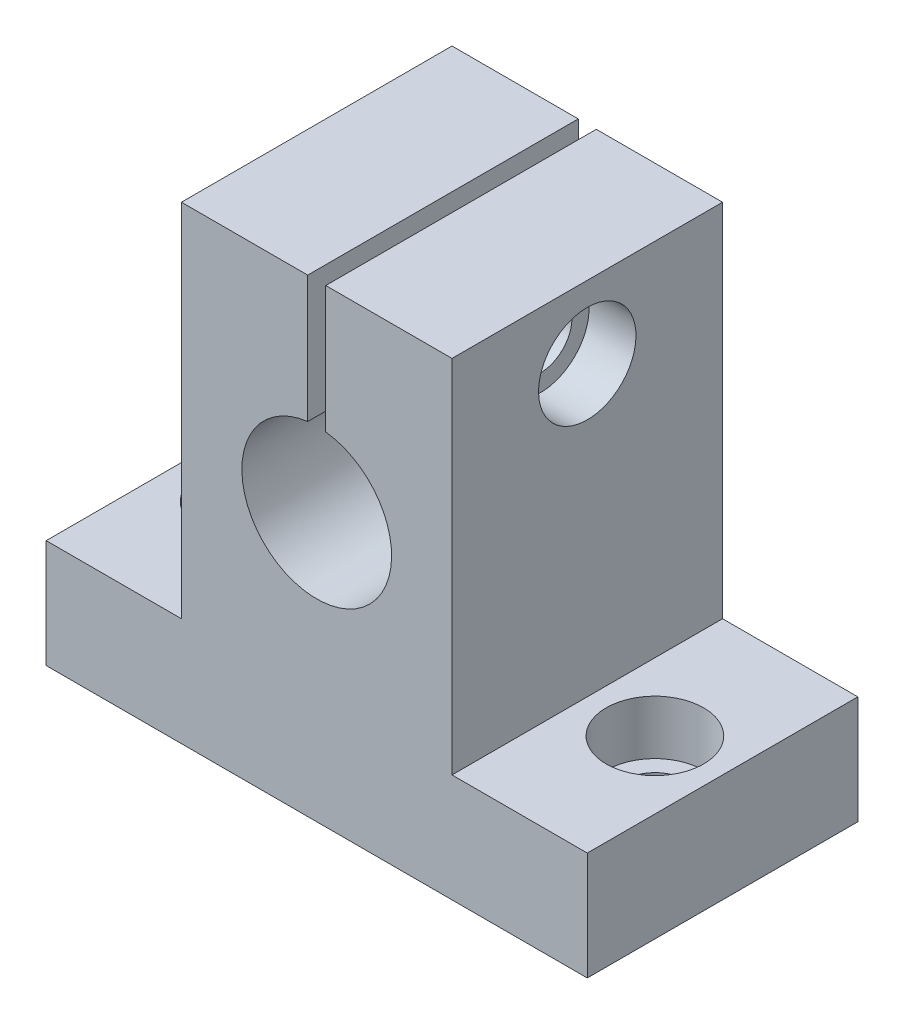
ISO-10303-21;
HEADER;
FILE_DESCRIPTION(('STEP AP214'),'2;1');
FILE_NAME('part.step','',(''),(''),'','','');
FILE_SCHEMA(('AUTOMOTIVE_DESIGN { 1 0 10303 214 1 1 1 1 }'));
ENDSEC;
DATA;
#1=APPLICATION_CONTEXT('core data for automotive mechanical design processes');
#2=APPLICATION_PROTOCOL_DEFINITION('international standard','automotive_design',2000,#1);
#3=PRODUCT_CONTEXT('',#1,'mechanical');
#4=PRODUCT('Part','Part','',(#3));
#5=PRODUCT_RELATED_PRODUCT_CATEGORY('part','',(#4));
#6=PRODUCT_DEFINITION_FORMATION('','',#4);
#7=PRODUCT_DEFINITION_CONTEXT('part definition',#1,'design');
#8=PRODUCT_DEFINITION('design','',#6,#7);
#9=PRODUCT_DEFINITION_SHAPE('','',#8);
#10=(LENGTH_UNIT() NAMED_UNIT(*) SI_UNIT(.MILLI.,.METRE.));
#11=(NAMED_UNIT(*) PLANE_ANGLE_UNIT() SI_UNIT($,.RADIAN.));
#12=(NAMED_UNIT(*) SI_UNIT($,.STERADIAN.) SOLID_ANGLE_UNIT());
#13=UNCERTAINTY_MEASURE_WITH_UNIT(LENGTH_MEASURE(1.E-05),#10,'distance_accuracy_value','');
#14=(GEOMETRIC_REPRESENTATION_CONTEXT(3) GLOBAL_UNCERTAINTY_ASSIGNED_CONTEXT((#13)) GLOBAL_UNIT_ASSIGNED_CONTEXT((#10,
#11,#12)) REPRESENTATION_CONTEXT('',''));
#15=CARTESIAN_POINT('',(0.,0.,0.));
#16=DIRECTION('',(0.,0.,1.));
#17=DIRECTION('',(1.,0.,0.));
#18=AXIS2_PLACEMENT_3D('',#15,#16,#17);
#19=CARTESIAN_POINT('',(11.25,-52.963943389495,7.5));
#20=DIRECTION('',(0.,1.,0.));
#21=DIRECTION('',(0.,0.,1.));
#22=AXIS2_PLACEMENT_3D('',#19,#20,#21);
#23=CYLINDRICAL_SURFACE('',#22,1.75);
#24=CARTESIAN_POINT('',(11.25,-16.,7.5));
#25=DIRECTION('',(0.,1.,0.));
#26=DIRECTION('',(0.,0.,1.));
#27=AXIS2_PLACEMENT_3D('',#24,#25,#26);
#28=CIRCLE('',#27,1.75);
#29=CARTESIAN_POINT('',(11.25,-16.,9.25));
#30=VERTEX_POINT('',#29);
#31=EDGE_CURVE('E280',#30,#30,#28,.F.);
#32=ORIENTED_EDGE('',*,*,#31,.T.);
#33=EDGE_LOOP('',(#32));
#34=FACE_BOUND('',#33,.T.);
#35=CARTESIAN_POINT('',(11.25,-13.,7.5));
#36=DIRECTION('',(0.,1.,0.));
#37=DIRECTION('',(-1.,0.,0.));
#38=AXIS2_PLACEMENT_3D('',#35,#36,#37);
#39=CIRCLE('',#38,1.75);
#40=CARTESIAN_POINT('',(9.5,-13.,7.5));
#41=VERTEX_POINT('',#40);
#42=EDGE_CURVE('E695',#41,#41,#39,.T.);
#43=ORIENTED_EDGE('',*,*,#42,.T.);
#44=EDGE_LOOP('',(#43));
#45=FACE_BOUND('',#44,.T.);
#46=ADVANCED_FACE('F16',(#34,#45),#23,.F.);
#47=CARTESIAN_POINT('',(-7.5,-1.09983721300845,15.));
#48=DIRECTION('',(1.,0.,0.));
#49=DIRECTION('',(0.,0.,-1.));
#50=AXIS2_PLACEMENT_3D('',#47,#48,#49);
#51=PLANE('',#50);
#52=DIRECTION('',(0.,-1.,0.));
#53=VECTOR('',#52,1.);
#54=CARTESIAN_POINT('',(-7.5,-1.09983721300845,0.));
#55=LINE('',#54,#53);
#56=CARTESIAN_POINT('',(-7.5,10.,0.));
#57=VERTEX_POINT('',#56);
#58=CARTESIAN_POINT('',(-7.5,-10.,0.));
#59=VERTEX_POINT('',#58);
#60=EDGE_CURVE('E343',#57,#59,#55,.T.);
#61=ORIENTED_EDGE('',*,*,#60,.T.);
#62=DIRECTION('',(0.,0.,-1.));
#63=VECTOR('',#62,1.);
#64=CARTESIAN_POINT('',(-7.5,-10.,15.));
#65=LINE('',#64,#63);
#66=CARTESIAN_POINT('',(-7.5,-10.,15.));
#67=VERTEX_POINT('',#66);
#68=EDGE_CURVE('E26',#67,#59,#65,.T.);
#69=ORIENTED_EDGE('',*,*,#68,.F.);
#70=DIRECTION('',(0.,-1.,0.));
#71=VECTOR('',#70,1.);
#72=CARTESIAN_POINT('',(-7.5,-1.09983721300845,15.));
#73=LINE('',#72,#71);
#74=CARTESIAN_POINT('',(-7.5,10.,15.));
#75=VERTEX_POINT('',#74);
#76=EDGE_CURVE('E308',#75,#67,#73,.T.);
#77=ORIENTED_EDGE('',*,*,#76,.F.);
#78=DIRECTION('',(0.,0.,-1.));
#79=VECTOR('',#78,1.);
#80=CARTESIAN_POINT('',(-7.5,10.,15.));
#81=LINE('',#80,#79);
#82=EDGE_CURVE('E10',#75,#57,#81,.T.);
#83=ORIENTED_EDGE('',*,*,#82,.T.);
#84=EDGE_LOOP('',(#61,#69,#77,#83));
#85=FACE_BOUND('',#84,.T.);
#86=DIRECTION('',(0.,-0.631260755806336,0.77557066614127));
#87=VECTOR('',#86,1.);
#88=CARTESIAN_POINT('',(-7.5,8.17159786519556,9.26753011625774));
#89=LINE('',#88,#87);
#90=CARTESIAN_POINT('',(-7.5,9.19208185361773,8.01375750421547));
#91=VERTEX_POINT('',#90);
#92=CARTESIAN_POINT('',(-7.5,7.15111387677338,10.5213027283));
#93=VERTEX_POINT('',#92);
#94=EDGE_CURVE('E193',#91,#93,#89,.T.);
#95=ORIENTED_EDGE('',*,*,#94,.T.);
#96=DIRECTION('',(0.,-0.987294277211527,-0.158902517869818));
#97=VECTOR('',#96,1.);
#98=CARTESIAN_POINT('',(-7.5,5.55507294996451,10.2644239761923));
#99=LINE('',#98,#97);
#100=CARTESIAN_POINT('',(-7.5,3.95903202315564,10.0075452240845));
#101=VERTEX_POINT('',#100);
#102=EDGE_CURVE('E216',#93,#101,#99,.T.);
#103=ORIENTED_EDGE('',*,*,#102,.T.);
#104=DIRECTION('',(0.,-0.356033521405191,-0.934473184011087));
#105=VECTOR('',#104,1.);
#106=CARTESIAN_POINT('',(-7.5,3.38347508476896,8.49689385993454));
#107=LINE('',#106,#105);
#108=CARTESIAN_POINT('',(-7.5,2.80791814638226,6.98624249578453));
#109=VERTEX_POINT('',#108);
#110=EDGE_CURVE('E39',#101,#109,#107,.T.);
#111=ORIENTED_EDGE('',*,*,#110,.T.);
#112=DIRECTION('',(0.,0.631260755806336,-0.77557066614127));
#113=VECTOR('',#112,1.);
#114=CARTESIAN_POINT('',(-7.5,3.82840213480445,5.73246988374226));
#115=LINE('',#114,#113);
#116=CARTESIAN_POINT('',(-7.5,4.84888612322662,4.47869727169999));
#117=VERTEX_POINT('',#116);
#118=EDGE_CURVE('E252',#109,#117,#115,.T.);
#119=ORIENTED_EDGE('',*,*,#118,.T.);
#120=DIRECTION('',(0.,0.987294277211528,0.158902517869817));
#121=VECTOR('',#120,1.);
#122=CARTESIAN_POINT('',(-7.5,6.44492705003549,4.73557602380772));
#123=LINE('',#122,#121);
#124=CARTESIAN_POINT('',(-7.5,8.04096797684435,4.99245477591546));
#125=VERTEX_POINT('',#124);
#126=EDGE_CURVE('E248',#117,#125,#123,.T.);
#127=ORIENTED_EDGE('',*,*,#126,.T.);
#128=DIRECTION('',(0.,0.356033521405192,0.934473184011087));
#129=VECTOR('',#128,1.);
#130=CARTESIAN_POINT('',(-7.5,8.61652491523104,6.50310614006546));
#131=LINE('',#130,#129);
#132=EDGE_CURVE('E244',#125,#91,#131,.T.);
#133=ORIENTED_EDGE('',*,*,#132,.T.);
#134=EDGE_LOOP('',(#95,#103,#111,#119,#127,#133));
#135=FACE_BOUND('',#134,.T.);
#136=ADVANCED_FACE('F426',(#85,#135),#51,.F.);
#137=CARTESIAN_POINT('',(-34.9481903478459,6.,7.5));
#138=DIRECTION('',(1.,0.,0.));
#139=DIRECTION('',(0.,0.,-1.));
#140=AXIS2_PLACEMENT_3D('',#137,#138,#139);
#141=CYLINDRICAL_SURFACE('',#140,1.75);
#142=CARTESIAN_POINT('',(-0.5,6.,7.5));
#143=DIRECTION('',(-1.,0.,0.));
#144=DIRECTION('',(0.,0.,1.));
#145=AXIS2_PLACEMENT_3D('',#142,#143,#144);
#146=CIRCLE('',#145,1.75);
#147=CARTESIAN_POINT('',(-0.5,6.,9.25));
#148=VERTEX_POINT('',#147);
#149=EDGE_CURVE('E20',#148,#148,#146,.T.);
#150=ORIENTED_EDGE('',*,*,#149,.F.);
#151=EDGE_LOOP('',(#150));
#152=FACE_BOUND('',#151,.T.);
#153=CARTESIAN_POINT('',(-5.,6.,7.5));
#154=DIRECTION('',(1.,0.,0.));
#155=DIRECTION('',(0.,0.,-1.));
#156=AXIS2_PLACEMENT_3D('',#153,#154,#155);
#157=CIRCLE('',#156,1.75);
#158=CARTESIAN_POINT('',(-5.,6.,5.75));
#159=VERTEX_POINT('',#158);
#160=EDGE_CURVE('E239',#159,#159,#157,.T.);
#161=ORIENTED_EDGE('',*,*,#160,.F.);
#162=EDGE_LOOP('',(#161));
#163=FACE_BOUND('',#162,.T.);
#164=ADVANCED_FACE('F419',(#152,#163),#141,.F.);
#165=CARTESIAN_POINT('',(0.0101335734500639,10.,15.));
#166=DIRECTION('',(0.,1.,0.));
#167=DIRECTION('',(0.,0.,1.));
#168=AXIS2_PLACEMENT_3D('',#165,#166,#167);
#169=PLANE('',#168);
#170=DIRECTION('',(1.,0.,0.));
#171=VECTOR('',#170,1.);
#172=CARTESIAN_POINT('',(0.0101335734500639,10.,0.));
#173=LINE('',#172,#171);
#174=CARTESIAN_POINT('',(0.5,10.,0.));
#175=VERTEX_POINT('',#174);
#176=CARTESIAN_POINT('',(7.5,10.,0.));
#177=VERTEX_POINT('',#176);
#178=EDGE_CURVE('E303',#175,#177,#173,.T.);
#179=ORIENTED_EDGE('',*,*,#178,.F.);
#180=DIRECTION('',(0.,0.,1.));
#181=VECTOR('',#180,1.);
#182=CARTESIAN_POINT('',(0.5,10.,7.5));
#183=LINE('',#182,#181);
#184=CARTESIAN_POINT('',(0.5,10.,15.));
#185=VERTEX_POINT('',#184);
#186=EDGE_CURVE('E279',#175,#185,#183,.T.);
#187=ORIENTED_EDGE('',*,*,#186,.T.);
#188=DIRECTION('',(1.,0.,0.));
#189=VECTOR('',#188,1.);
#190=CARTESIAN_POINT('',(0.0101335734500639,10.,15.));
#191=LINE('',#190,#189);
#192=CARTESIAN_POINT('',(7.5,10.,15.));
#193=VERTEX_POINT('',#192);
#194=EDGE_CURVE('E309',#185,#193,#191,.T.);
#195=ORIENTED_EDGE('',*,*,#194,.T.);
#196=DIRECTION('',(0.,0.,-1.));
#197=VECTOR('',#196,1.);
#198=CARTESIAN_POINT('',(7.5,10.,15.));
#199=LINE('',#198,#197);
#200=EDGE_CURVE('E338',#193,#177,#199,.T.);
#201=ORIENTED_EDGE('',*,*,#200,.T.);
#202=EDGE_LOOP('',(#179,#187,#195,#201));
#203=FACE_BOUND('',#202,.T.);
#204=ADVANCED_FACE('F440',(#203),#169,.T.);
#205=CARTESIAN_POINT('',(0.,-3.,15.));
#206=DIRECTION('',(0.,0.,1.));
#207=DIRECTION('',(1.,0.,0.));
#208=AXIS2_PLACEMENT_3D('',#205,#206,#207);
#209=PLANE('',#208);
#210=CARTESIAN_POINT('',(0.,-1.15,15.));
#211=DIRECTION('',(0.,0.,1.));
#212=DIRECTION('',(1.,0.,0.));
#213=AXIS2_PLACEMENT_3D('',#210,#211,#212);
#214=CIRCLE('',#213,4.15);
#215=CARTESIAN_POINT('',(-0.5,2.9697694110229,15.));
#216=VERTEX_POINT('',#215);
#217=CARTESIAN_POINT('',(0.5,2.9697694110229,15.));
#218=VERTEX_POINT('',#217);
#219=EDGE_CURVE('E334',#216,#218,#214,.T.);
#220=ORIENTED_EDGE('',*,*,#219,.F.);
#221=DIRECTION('',(0.,1.,0.));
#222=VECTOR('',#221,1.);
#223=CARTESIAN_POINT('',(-0.5,0.,15.));
#224=LINE('',#223,#222);
#225=CARTESIAN_POINT('',(-0.5,10.,15.));
#226=VERTEX_POINT('',#225);
#227=EDGE_CURVE('E51',#216,#226,#224,.T.);
#228=ORIENTED_EDGE('',*,*,#227,.T.);
#229=EDGE_CURVE('E304',#75,#226,#191,.T.);
#230=ORIENTED_EDGE('',*,*,#229,.F.);
#231=ORIENTED_EDGE('',*,*,#76,.T.);
#232=DIRECTION('',(1.,0.,0.));
#233=VECTOR('',#232,1.);
#234=CARTESIAN_POINT('',(-12.2312085309041,-10.,15.));
#235=LINE('',#234,#233);
#236=CARTESIAN_POINT('',(-15.,-10.,15.));
#237=VERTEX_POINT('',#236);
#238=EDGE_CURVE('E312',#237,#67,#235,.T.);
#239=ORIENTED_EDGE('',*,*,#238,.F.);
#240=DIRECTION('',(0.,-1.,0.));
#241=VECTOR('',#240,1.);
#242=CARTESIAN_POINT('',(-15.,-12.9314772319689,15.));
#243=LINE('',#242,#241);
#244=CARTESIAN_POINT('',(-15.,-16.,15.));
#245=VERTEX_POINT('',#244);
#246=EDGE_CURVE('E316',#237,#245,#243,.T.);
#247=ORIENTED_EDGE('',*,*,#246,.T.);
#248=DIRECTION('',(1.,0.,0.));
#249=VECTOR('',#248,1.);
#250=CARTESIAN_POINT('',(-0.192547598475021,-16.,15.));
#251=LINE('',#250,#249);
#252=CARTESIAN_POINT('',(15.,-16.,15.));
#253=VERTEX_POINT('',#252);
#254=EDGE_CURVE('E319',#245,#253,#251,.T.);
#255=ORIENTED_EDGE('',*,*,#254,.T.);
#256=DIRECTION('',(0.,-1.,0.));
#257=VECTOR('',#256,1.);
#258=CARTESIAN_POINT('',(15.,-16.7781049479399,15.));
#259=LINE('',#258,#257);
#260=CARTESIAN_POINT('',(15.,-10.,15.));
#261=VERTEX_POINT('',#260);
#262=EDGE_CURVE('E322',#261,#253,#259,.T.);
#263=ORIENTED_EDGE('',*,*,#262,.F.);
#264=DIRECTION('',(1.,0.,0.));
#265=VECTOR('',#264,1.);
#266=CARTESIAN_POINT('',(11.9481068629648,-10.,15.));
#267=LINE('',#266,#265);
#268=CARTESIAN_POINT('',(7.5,-10.,15.));
#269=VERTEX_POINT('',#268);
#270=EDGE_CURVE('E326',#269,#261,#267,.T.);
#271=ORIENTED_EDGE('',*,*,#270,.F.);
#272=DIRECTION('',(0.,-1.,0.));
#273=VECTOR('',#272,1.);
#274=CARTESIAN_POINT('',(7.5,-1.10016278699155,15.));
#275=LINE('',#274,#273);
#276=EDGE_CURVE('E330',#193,#269,#275,.T.);
#277=ORIENTED_EDGE('',*,*,#276,.F.);
#278=ORIENTED_EDGE('',*,*,#194,.F.);
#279=DIRECTION('',(0.,1.,0.));
#280=VECTOR('',#279,1.);
#281=CARTESIAN_POINT('',(0.5,0.,15.));
#282=LINE('',#281,#280);
#283=EDGE_CURVE('E288',#218,#185,#282,.T.);
#284=ORIENTED_EDGE('',*,*,#283,.F.);
#285=EDGE_LOOP('',(#220,#228,#230,#231,#239,#247,#255,#263,#271,#277,#278,#284));
#286=FACE_BOUND('',#285,.T.);
#287=ADVANCED_FACE('F437',(#286),#209,.T.);
#288=DIRECTION('',(0.,0.,1.));
#289=VECTOR('',#288,1.);
#290=CARTESIAN_POINT('',(-0.5,10.,7.5));
#291=LINE('',#290,#289);
#292=CARTESIAN_POINT('',(-0.5,10.,0.));
#293=VERTEX_POINT('',#292);
#294=EDGE_CURVE('E276',#293,#226,#291,.T.);
#295=ORIENTED_EDGE('',*,*,#294,.F.);
#296=EDGE_CURVE('E339',#57,#293,#173,.T.);
#297=ORIENTED_EDGE('',*,*,#296,.F.);
#298=ORIENTED_EDGE('',*,*,#82,.F.);
#299=ORIENTED_EDGE('',*,*,#229,.T.);
#300=EDGE_LOOP('',(#295,#297,#298,#299));
#301=FACE_BOUND('',#300,.T.);
#302=ADVANCED_FACE('F18',(#301),#169,.T.);
#303=CARTESIAN_POINT('',(-12.2312085309041,-10.,15.));
#304=DIRECTION('',(0.,1.,0.));
#305=DIRECTION('',(0.,0.,1.));
#306=AXIS2_PLACEMENT_3D('',#303,#304,#305);
#307=PLANE('',#306);
#308=CARTESIAN_POINT('',(-11.25,-10.,7.5));
#309=DIRECTION('',(0.,1.,0.));
#310=DIRECTION('',(-1.,0.,0.));
#311=AXIS2_PLACEMENT_3D('',#308,#309,#310);
#312=CIRCLE('',#311,2.7);
#313=CARTESIAN_POINT('',(-13.95,-10.,7.5));
#314=VERTEX_POINT('',#313);
#315=EDGE_CURVE('E477',#314,#314,#312,.T.);
#316=ORIENTED_EDGE('',*,*,#315,.F.);
#317=EDGE_LOOP('',(#316));
#318=FACE_BOUND('',#317,.T.);
#319=DIRECTION('',(1.,0.,0.));
#320=VECTOR('',#319,1.);
#321=CARTESIAN_POINT('',(-12.2312085309041,-10.,0.));
#322=LINE('',#321,#320);
#323=CARTESIAN_POINT('',(-15.,-10.,0.));
#324=VERTEX_POINT('',#323);
#325=EDGE_CURVE('E347',#324,#59,#322,.T.);
#326=ORIENTED_EDGE('',*,*,#325,.F.);
#327=DIRECTION('',(0.,0.,-1.));
#328=VECTOR('',#327,1.);
#329=CARTESIAN_POINT('',(-15.,-10.,15.));
#330=LINE('',#329,#328);
#331=EDGE_CURVE('E390',#237,#324,#330,.T.);
#332=ORIENTED_EDGE('',*,*,#331,.F.);
#333=ORIENTED_EDGE('',*,*,#238,.T.);
#334=ORIENTED_EDGE('',*,*,#68,.T.);
#335=EDGE_LOOP('',(#326,#332,#333,#334));
#336=FACE_BOUND('',#335,.T.);
#337=ADVANCED_FACE('F466',(#318,#336),#307,.T.);
#338=CARTESIAN_POINT('',(-15.,-12.9314772319689,15.));
#339=DIRECTION('',(1.,0.,0.));
#340=DIRECTION('',(0.,0.,-1.));
#341=AXIS2_PLACEMENT_3D('',#338,#339,#340);
#342=PLANE('',#341);
#343=DIRECTION('',(0.,-1.,0.));
#344=VECTOR('',#343,1.);
#345=CARTESIAN_POINT('',(-15.,-12.9314772319689,0.));
#346=LINE('',#345,#344);
#347=CARTESIAN_POINT('',(-15.,-16.,0.));
#348=VERTEX_POINT('',#347);
#349=EDGE_CURVE('E351',#324,#348,#346,.T.);
#350=ORIENTED_EDGE('',*,*,#349,.T.);
#351=DIRECTION('',(0.,0.,-1.));
#352=VECTOR('',#351,1.);
#353=CARTESIAN_POINT('',(-15.,-16.,15.));
#354=LINE('',#353,#352);
#355=EDGE_CURVE('E386',#245,#348,#354,.T.);
#356=ORIENTED_EDGE('',*,*,#355,.F.);
#357=ORIENTED_EDGE('',*,*,#246,.F.);
#358=ORIENTED_EDGE('',*,*,#331,.T.);
#359=EDGE_LOOP('',(#350,#356,#357,#358));
#360=FACE_BOUND('',#359,.T.);
#361=ADVANCED_FACE('F463',(#360),#342,.F.);
#362=CARTESIAN_POINT('',(-0.192547598475021,-16.,15.));
#363=DIRECTION('',(0.,1.,0.));
#364=DIRECTION('',(0.,0.,1.));
#365=AXIS2_PLACEMENT_3D('',#362,#363,#364);
#366=PLANE('',#365);
#367=CARTESIAN_POINT('',(-11.25,-16.,7.5));
#368=DIRECTION('',(0.,1.,0.));
#369=DIRECTION('',(0.,0.,1.));
#370=AXIS2_PLACEMENT_3D('',#367,#368,#369);
#371=CIRCLE('',#370,1.75);
#372=CARTESIAN_POINT('',(-11.25,-16.,9.25));
#373=VERTEX_POINT('',#372);
#374=EDGE_CURVE('E275',#373,#373,#371,.T.);
#375=ORIENTED_EDGE('',*,*,#374,.T.);
#376=EDGE_LOOP('',(#375));
#377=FACE_BOUND('',#376,.T.);
#378=ORIENTED_EDGE('',*,*,#31,.F.);
#379=EDGE_LOOP('',(#378));
#380=FACE_BOUND('',#379,.T.);
#381=DIRECTION('',(1.,0.,0.));
#382=VECTOR('',#381,1.);
#383=CARTESIAN_POINT('',(-0.192547598475021,-16.,0.));
#384=LINE('',#383,#382);
#385=CARTESIAN_POINT('',(15.,-16.,0.));
#386=VERTEX_POINT('',#385);
#387=EDGE_CURVE('E354',#348,#386,#384,.T.);
#388=ORIENTED_EDGE('',*,*,#387,.T.);
#389=DIRECTION('',(0.,0.,-1.));
#390=VECTOR('',#389,1.);
#391=CARTESIAN_POINT('',(15.,-16.,15.));
#392=LINE('',#391,#390);
#393=EDGE_CURVE('E383',#253,#386,#392,.T.);
#394=ORIENTED_EDGE('',*,*,#393,.F.);
#395=ORIENTED_EDGE('',*,*,#254,.F.);
#396=ORIENTED_EDGE('',*,*,#355,.T.);
#397=EDGE_LOOP('',(#388,#394,#395,#396));
#398=FACE_BOUND('',#397,.T.);
#399=ADVANCED_FACE('F404',(#377,#380,#398),#366,.F.);
#400=CARTESIAN_POINT('',(15.,-16.7781049479399,15.));
#401=DIRECTION('',(1.,0.,0.));
#402=DIRECTION('',(0.,0.,-1.));
#403=AXIS2_PLACEMENT_3D('',#400,#401,#402);
#404=PLANE('',#403);
#405=DIRECTION('',(0.,-1.,0.));
#406=VECTOR('',#405,1.);
#407=CARTESIAN_POINT('',(15.,-16.7781049479399,0.));
#408=LINE('',#407,#406);
#409=CARTESIAN_POINT('',(15.,-10.,0.));
#410=VERTEX_POINT('',#409);
#411=EDGE_CURVE('E358',#410,#386,#408,.T.);
#412=ORIENTED_EDGE('',*,*,#411,.F.);
#413=DIRECTION('',(0.,0.,-1.));
#414=VECTOR('',#413,1.);
#415=CARTESIAN_POINT('',(15.,-10.,15.));
#416=LINE('',#415,#414);
#417=EDGE_CURVE('E380',#261,#410,#416,.T.);
#418=ORIENTED_EDGE('',*,*,#417,.F.);
#419=ORIENTED_EDGE('',*,*,#262,.T.);
#420=ORIENTED_EDGE('',*,*,#393,.T.);
#421=EDGE_LOOP('',(#412,#418,#419,#420));
#422=FACE_BOUND('',#421,.T.);
#423=ADVANCED_FACE('F456',(#422),#404,.T.);
#424=CARTESIAN_POINT('',(11.9481068629648,-10.,15.));
#425=DIRECTION('',(0.,1.,0.));
#426=DIRECTION('',(0.,0.,1.));
#427=AXIS2_PLACEMENT_3D('',#424,#425,#426);
#428=PLANE('',#427);
#429=CARTESIAN_POINT('',(11.25,-10.,7.5));
#430=DIRECTION('',(0.,1.,0.));
#431=DIRECTION('',(-1.,0.,0.));
#432=AXIS2_PLACEMENT_3D('',#429,#430,#431);
#433=CIRCLE('',#432,2.7);
#434=CARTESIAN_POINT('',(8.55,-10.,7.5));
#435=VERTEX_POINT('',#434);
#436=EDGE_CURVE('E704',#435,#435,#433,.T.);
#437=ORIENTED_EDGE('',*,*,#436,.F.);
#438=EDGE_LOOP('',(#437));
#439=FACE_BOUND('',#438,.T.);
#440=DIRECTION('',(1.,0.,0.));
#441=VECTOR('',#440,1.);
#442=CARTESIAN_POINT('',(11.9481068629648,-10.,0.));
#443=LINE('',#442,#441);
#444=CARTESIAN_POINT('',(7.5,-10.,0.));
#445=VERTEX_POINT('',#444);
#446=EDGE_CURVE('E362',#445,#410,#443,.T.);
#447=ORIENTED_EDGE('',*,*,#446,.F.);
#448=DIRECTION('',(0.,0.,-1.));
#449=VECTOR('',#448,1.);
#450=CARTESIAN_POINT('',(7.5,-10.,15.));
#451=LINE('',#450,#449);
#452=EDGE_CURVE('E377',#269,#445,#451,.T.);
#453=ORIENTED_EDGE('',*,*,#452,.F.);
#454=ORIENTED_EDGE('',*,*,#270,.T.);
#455=ORIENTED_EDGE('',*,*,#417,.T.);
#456=EDGE_LOOP('',(#447,#453,#454,#455));
#457=FACE_BOUND('',#456,.T.);
#458=ADVANCED_FACE('F452',(#439,#457),#428,.T.);
#459=CARTESIAN_POINT('',(7.5,-1.10016278699155,15.));
#460=DIRECTION('',(1.,0.,0.));
#461=DIRECTION('',(0.,0.,-1.));
#462=AXIS2_PLACEMENT_3D('',#459,#460,#461);
#463=PLANE('',#462);
#464=CARTESIAN_POINT('',(7.5,6.,7.5));
#465=DIRECTION('',(1.,0.,0.));
#466=DIRECTION('',(0.,1.,0.));
#467=AXIS2_PLACEMENT_3D('',#464,#465,#466);
#468=CIRCLE('',#467,2.7);
#469=CARTESIAN_POINT('',(7.5,8.7,7.5));
#470=VERTEX_POINT('',#469);
#471=EDGE_CURVE('E225',#470,#470,#468,.T.);
#472=ORIENTED_EDGE('',*,*,#471,.F.);
#473=EDGE_LOOP('',(#472));
#474=FACE_BOUND('',#473,.T.);
#475=DIRECTION('',(0.,-1.,0.));
#476=VECTOR('',#475,1.);
#477=CARTESIAN_POINT('',(7.5,-1.10016278699155,0.));
#478=LINE('',#477,#476);
#479=EDGE_CURVE('E366',#177,#445,#478,.T.);
#480=ORIENTED_EDGE('',*,*,#479,.F.);
#481=ORIENTED_EDGE('',*,*,#200,.F.);
#482=ORIENTED_EDGE('',*,*,#276,.T.);
#483=ORIENTED_EDGE('',*,*,#452,.T.);
#484=EDGE_LOOP('',(#480,#481,#482,#483));
#485=FACE_BOUND('',#484,.T.);
#486=ADVANCED_FACE('F448',(#474,#485),#463,.T.);
#487=CARTESIAN_POINT('',(0.,-1.15,15.));
#488=DIRECTION('',(0.,0.,-1.));
#489=DIRECTION('',(-1.,0.,0.));
#490=AXIS2_PLACEMENT_3D('',#487,#488,#489);
#491=CYLINDRICAL_SURFACE('',#490,4.15);
#492=DIRECTION('',(0.,0.,-1.));
#493=VECTOR('',#492,1.);
#494=CARTESIAN_POINT('',(-0.5,2.9697694110229,15.));
#495=LINE('',#494,#493);
#496=CARTESIAN_POINT('',(-0.5,2.9697694110229,0.));
#497=VERTEX_POINT('',#496);
#498=EDGE_CURVE('E300',#216,#497,#495,.T.);
#499=ORIENTED_EDGE('',*,*,#498,.F.);
#500=ORIENTED_EDGE('',*,*,#219,.T.);
#501=DIRECTION('',(0.,0.,-1.));
#502=VECTOR('',#501,1.);
#503=CARTESIAN_POINT('',(0.5,2.9697694110229,15.));
#504=LINE('',#503,#502);
#505=CARTESIAN_POINT('',(0.5,2.9697694110229,0.));
#506=VERTEX_POINT('',#505);
#507=EDGE_CURVE('E296',#218,#506,#504,.T.);
#508=ORIENTED_EDGE('',*,*,#507,.T.);
#509=CARTESIAN_POINT('',(0.,-1.15,0.));
#510=DIRECTION('',(0.,0.,1.));
#511=DIRECTION('',(1.,0.,0.));
#512=AXIS2_PLACEMENT_3D('',#509,#510,#511);
#513=CIRCLE('',#512,4.15);
#514=EDGE_CURVE('E370',#497,#506,#513,.T.);
#515=ORIENTED_EDGE('',*,*,#514,.F.);
#516=EDGE_LOOP('',(#499,#500,#508,#515));
#517=FACE_BOUND('',#516,.T.);
#518=ADVANCED_FACE('F444',(#517),#491,.F.);
#519=CARTESIAN_POINT('',(0.,-3.,0.));
#520=DIRECTION('',(0.,0.,1.));
#521=DIRECTION('',(1.,0.,0.));
#522=AXIS2_PLACEMENT_3D('',#519,#520,#521);
#523=PLANE('',#522);
#524=ORIENTED_EDGE('',*,*,#514,.T.);
#525=DIRECTION('',(0.,1.,0.));
#526=VECTOR('',#525,1.);
#527=CARTESIAN_POINT('',(0.5,0.,0.));
#528=LINE('',#527,#526);
#529=EDGE_CURVE('E284',#506,#175,#528,.T.);
#530=ORIENTED_EDGE('',*,*,#529,.T.);
#531=ORIENTED_EDGE('',*,*,#178,.T.);
#532=ORIENTED_EDGE('',*,*,#479,.T.);
#533=ORIENTED_EDGE('',*,*,#446,.T.);
#534=ORIENTED_EDGE('',*,*,#411,.T.);
#535=ORIENTED_EDGE('',*,*,#387,.F.);
#536=ORIENTED_EDGE('',*,*,#349,.F.);
#537=ORIENTED_EDGE('',*,*,#325,.T.);
#538=ORIENTED_EDGE('',*,*,#60,.F.);
#539=ORIENTED_EDGE('',*,*,#296,.T.);
#540=DIRECTION('',(0.,1.,0.));
#541=VECTOR('',#540,1.);
#542=CARTESIAN_POINT('',(-0.5,0.,0.));
#543=LINE('',#542,#541);
#544=EDGE_CURVE('E293',#497,#293,#543,.T.);
#545=ORIENTED_EDGE('',*,*,#544,.F.);
#546=EDGE_LOOP('',(#524,#530,#531,#532,#533,#534,#535,#536,#537,#538,#539,#545));
#547=FACE_BOUND('',#546,.T.);
#548=ADVANCED_FACE('F434',(#547),#523,.F.);
#549=CARTESIAN_POINT('',(0.5,0.,7.5));
#550=DIRECTION('',(-1.,0.,0.));
#551=DIRECTION('',(0.,0.,1.));
#552=AXIS2_PLACEMENT_3D('',#549,#550,#551);
#553=PLANE('',#552);
#554=CARTESIAN_POINT('',(0.5,6.,7.5));
#555=DIRECTION('',(-1.,0.,0.));
#556=DIRECTION('',(0.,0.,1.));
#557=AXIS2_PLACEMENT_3D('',#554,#555,#556);
#558=CIRCLE('',#557,1.75);
#559=CARTESIAN_POINT('',(0.5,6.,9.25));
#560=VERTEX_POINT('',#559);
#561=EDGE_CURVE('E271',#560,#560,#558,.T.);
#562=ORIENTED_EDGE('',*,*,#561,.F.);
#563=EDGE_LOOP('',(#562));
#564=FACE_BOUND('',#563,.T.);
#565=ORIENTED_EDGE('',*,*,#283,.T.);
#566=ORIENTED_EDGE('',*,*,#186,.F.);
#567=ORIENTED_EDGE('',*,*,#529,.F.);
#568=ORIENTED_EDGE('',*,*,#507,.F.);
#569=EDGE_LOOP('',(#565,#566,#567,#568));
#570=FACE_BOUND('',#569,.T.);
#571=ADVANCED_FACE('F420',(#564,#570),#553,.T.);
#572=CARTESIAN_POINT('',(-0.5,0.,7.5));
#573=DIRECTION('',(-1.,0.,0.));
#574=DIRECTION('',(0.,0.,1.));
#575=AXIS2_PLACEMENT_3D('',#572,#573,#574);
#576=PLANE('',#575);
#577=ORIENTED_EDGE('',*,*,#149,.T.);
#578=EDGE_LOOP('',(#577));
#579=FACE_BOUND('',#578,.T.);
#580=ORIENTED_EDGE('',*,*,#498,.T.);
#581=ORIENTED_EDGE('',*,*,#544,.T.);
#582=ORIENTED_EDGE('',*,*,#294,.T.);
#583=ORIENTED_EDGE('',*,*,#227,.F.);
#584=EDGE_LOOP('',(#580,#581,#582,#583));
#585=FACE_BOUND('',#584,.T.);
#586=ADVANCED_FACE('F410',(#579,#585),#576,.F.);
#587=CARTESIAN_POINT('',(-11.25,-35.,7.5));
#588=DIRECTION('',(0.,1.,0.));
#589=DIRECTION('',(0.,0.,1.));
#590=AXIS2_PLACEMENT_3D('',#587,#588,#589);
#591=CYLINDRICAL_SURFACE('',#590,1.75);
#592=CARTESIAN_POINT('',(-11.25,-13.,7.5));
#593=DIRECTION('',(0.,1.,0.));
#594=DIRECTION('',(-1.,0.,0.));
#595=AXIS2_PLACEMENT_3D('',#592,#593,#594);
#596=CIRCLE('',#595,1.75);
#597=CARTESIAN_POINT('',(-13.,-13.,7.5));
#598=VERTEX_POINT('',#597);
#599=EDGE_CURVE('E702',#598,#598,#596,.T.);
#600=ORIENTED_EDGE('',*,*,#599,.T.);
#601=EDGE_LOOP('',(#600));
#602=FACE_BOUND('',#601,.T.);
#603=ORIENTED_EDGE('',*,*,#374,.F.);
#604=EDGE_LOOP('',(#603));
#605=FACE_BOUND('',#604,.T.);
#606=ADVANCED_FACE('F407',(#602,#605),#591,.F.);
#607=CARTESIAN_POINT('',(4.9,6.,7.5));
#608=DIRECTION('',(1.,0.,0.));
#609=DIRECTION('',(0.,1.,0.));
#610=AXIS2_PLACEMENT_3D('',#607,#608,#609);
#611=CIRCLE('',#610,1.75);
#612=CARTESIAN_POINT('',(4.9,7.75,7.5));
#613=VERTEX_POINT('',#612);
#614=EDGE_CURVE('E714',#613,#613,#611,.T.);
#615=ORIENTED_EDGE('',*,*,#614,.T.);
#616=EDGE_LOOP('',(#615));
#617=FACE_BOUND('',#616,.T.);
#618=ORIENTED_EDGE('',*,*,#561,.T.);
#619=EDGE_LOOP('',(#618));
#620=FACE_BOUND('',#619,.T.);
#621=ADVANCED_FACE('F409',(#617,#620),#141,.F.);
#622=CARTESIAN_POINT('',(-5.,8.17159786519556,9.26753011625774));
#623=DIRECTION('',(0.,-0.77557066614127,-0.631260755806336));
#624=DIRECTION('',(0.,0.631260755806336,-0.77557066614127));
#625=AXIS2_PLACEMENT_3D('',#622,#623,#624);
#626=PLANE('',#625);
#627=ORIENTED_EDGE('',*,*,#94,.F.);
#628=DIRECTION('',(-1.,0.,0.));
#629=VECTOR('',#628,1.);
#630=CARTESIAN_POINT('',(-5.,9.19208185361773,8.01375750421547));
#631=LINE('',#630,#629);
#632=CARTESIAN_POINT('',(-5.,9.19208185361773,8.01375750421547));
#633=VERTEX_POINT('',#632);
#634=EDGE_CURVE('E187',#633,#91,#631,.T.);
#635=ORIENTED_EDGE('',*,*,#634,.F.);
#636=DIRECTION('',(0.,-0.631260755806336,0.77557066614127));
#637=VECTOR('',#636,1.);
#638=CARTESIAN_POINT('',(-5.,8.17159786519556,9.26753011625774));
#639=LINE('',#638,#637);
#640=CARTESIAN_POINT('',(-5.,7.15111387677338,10.5213027283));
#641=VERTEX_POINT('',#640);
#642=EDGE_CURVE('E191',#633,#641,#639,.T.);
#643=ORIENTED_EDGE('',*,*,#642,.T.);
#644=DIRECTION('',(-1.,0.,0.));
#645=VECTOR('',#644,1.);
#646=CARTESIAN_POINT('',(-5.,7.15111387677338,10.5213027283));
#647=LINE('',#646,#645);
#648=EDGE_CURVE('E242',#641,#93,#647,.T.);
#649=ORIENTED_EDGE('',*,*,#648,.T.);
#650=EDGE_LOOP('',(#627,#635,#643,#649));
#651=FACE_BOUND('',#650,.T.);
#652=ADVANCED_FACE('F189',(#651),#626,.T.);
#653=CARTESIAN_POINT('',(-5.,8.61652491523104,6.50310614006546));
#654=DIRECTION('',(0.,-0.934473184011087,0.356033521405192));
#655=DIRECTION('',(0.,-0.356033521405192,-0.934473184011087));
#656=AXIS2_PLACEMENT_3D('',#653,#654,#655);
#657=PLANE('',#656);
#658=ORIENTED_EDGE('',*,*,#132,.F.);
#659=DIRECTION('',(-1.,0.,0.));
#660=VECTOR('',#659,1.);
#661=CARTESIAN_POINT('',(-5.,8.04096797684435,4.99245477591546));
#662=LINE('',#661,#660);
#663=CARTESIAN_POINT('',(-5.,8.04096797684435,4.99245477591546));
#664=VERTEX_POINT('',#663);
#665=EDGE_CURVE('E198',#664,#125,#662,.T.);
#666=ORIENTED_EDGE('',*,*,#665,.F.);
#667=DIRECTION('',(0.,0.356033521405192,0.934473184011087));
#668=VECTOR('',#667,1.);
#669=CARTESIAN_POINT('',(-5.,8.61652491523104,6.50310614006546));
#670=LINE('',#669,#668);
#671=EDGE_CURVE('E201',#664,#633,#670,.T.);
#672=ORIENTED_EDGE('',*,*,#671,.T.);
#673=ORIENTED_EDGE('',*,*,#634,.T.);
#674=EDGE_LOOP('',(#658,#666,#672,#673));
#675=FACE_BOUND('',#674,.T.);
#676=ADVANCED_FACE('F202',(#675),#657,.T.);
#677=CARTESIAN_POINT('',(-5.,6.44492705003549,4.73557602380772));
#678=DIRECTION('',(0.,-0.158902517869817,0.987294277211528));
#679=DIRECTION('',(0.,-0.987294277211528,-0.158902517869817));
#680=AXIS2_PLACEMENT_3D('',#677,#678,#679);
#681=PLANE('',#680);
#682=ORIENTED_EDGE('',*,*,#126,.F.);
#683=DIRECTION('',(-1.,0.,0.));
#684=VECTOR('',#683,1.);
#685=CARTESIAN_POINT('',(-5.,4.84888612322662,4.47869727169999));
#686=LINE('',#685,#684);
#687=CARTESIAN_POINT('',(-5.,4.84888612322662,4.47869727169999));
#688=VERTEX_POINT('',#687);
#689=EDGE_CURVE('E266',#688,#117,#686,.T.);
#690=ORIENTED_EDGE('',*,*,#689,.F.);
#691=DIRECTION('',(0.,0.987294277211528,0.158902517869817));
#692=VECTOR('',#691,1.);
#693=CARTESIAN_POINT('',(-5.,6.44492705003549,4.73557602380772));
#694=LINE('',#693,#692);
#695=EDGE_CURVE('E207',#688,#664,#694,.T.);
#696=ORIENTED_EDGE('',*,*,#695,.T.);
#697=ORIENTED_EDGE('',*,*,#665,.T.);
#698=EDGE_LOOP('',(#682,#690,#696,#697));
#699=FACE_BOUND('',#698,.T.);
#700=ADVANCED_FACE('F611',(#699),#681,.T.);
#701=CARTESIAN_POINT('',(-5.,3.82840213480445,5.73246988374226));
#702=DIRECTION('',(0.,0.77557066614127,0.631260755806336));
#703=DIRECTION('',(0.,-0.631260755806336,0.77557066614127));
#704=AXIS2_PLACEMENT_3D('',#701,#702,#703);
#705=PLANE('',#704);
#706=ORIENTED_EDGE('',*,*,#118,.F.);
#707=DIRECTION('',(-1.,0.,0.));
#708=VECTOR('',#707,1.);
#709=CARTESIAN_POINT('',(-5.,2.80791814638226,6.98624249578453));
#710=LINE('',#709,#708);
#711=CARTESIAN_POINT('',(-5.,2.80791814638226,6.98624249578453));
#712=VERTEX_POINT('',#711);
#713=EDGE_CURVE('E263',#712,#109,#710,.T.);
#714=ORIENTED_EDGE('',*,*,#713,.F.);
#715=DIRECTION('',(0.,0.631260755806336,-0.77557066614127));
#716=VECTOR('',#715,1.);
#717=CARTESIAN_POINT('',(-5.,3.82840213480445,5.73246988374226));
#718=LINE('',#717,#716);
#719=EDGE_CURVE('E230',#712,#688,#718,.T.);
#720=ORIENTED_EDGE('',*,*,#719,.T.);
#721=ORIENTED_EDGE('',*,*,#689,.T.);
#722=EDGE_LOOP('',(#706,#714,#720,#721));
#723=FACE_BOUND('',#722,.T.);
#724=ADVANCED_FACE('F617',(#723),#705,.T.);
#725=CARTESIAN_POINT('',(-5.,3.38347508476896,8.49689385993454));
#726=DIRECTION('',(0.,0.934473184011087,-0.356033521405191));
#727=DIRECTION('',(0.,0.356033521405191,0.934473184011087));
#728=AXIS2_PLACEMENT_3D('',#725,#726,#727);
#729=PLANE('',#728);
#730=ORIENTED_EDGE('',*,*,#110,.F.);
#731=DIRECTION('',(-1.,0.,0.));
#732=VECTOR('',#731,1.);
#733=CARTESIAN_POINT('',(-5.,3.95903202315564,10.0075452240845));
#734=LINE('',#733,#732);
#735=CARTESIAN_POINT('',(-5.,3.95903202315564,10.0075452240845));
#736=VERTEX_POINT('',#735);
#737=EDGE_CURVE('E260',#736,#101,#734,.T.);
#738=ORIENTED_EDGE('',*,*,#737,.F.);
#739=DIRECTION('',(0.,-0.356033521405191,-0.934473184011087));
#740=VECTOR('',#739,1.);
#741=CARTESIAN_POINT('',(-5.,3.38347508476896,8.49689385993454));
#742=LINE('',#741,#740);
#743=EDGE_CURVE('E234',#736,#712,#742,.T.);
#744=ORIENTED_EDGE('',*,*,#743,.T.);
#745=ORIENTED_EDGE('',*,*,#713,.T.);
#746=EDGE_LOOP('',(#730,#738,#744,#745));
#747=FACE_BOUND('',#746,.T.);
#748=ADVANCED_FACE('F624',(#747),#729,.T.);
#749=CARTESIAN_POINT('',(-5.,5.55507294996451,10.2644239761923));
#750=DIRECTION('',(0.,0.158902517869818,-0.987294277211527));
#751=DIRECTION('',(0.,0.987294277211527,0.158902517869818));
#752=AXIS2_PLACEMENT_3D('',#749,#750,#751);
#753=PLANE('',#752);
#754=ORIENTED_EDGE('',*,*,#102,.F.);
#755=ORIENTED_EDGE('',*,*,#648,.F.);
#756=DIRECTION('',(0.,-0.987294277211527,-0.158902517869818));
#757=VECTOR('',#756,1.);
#758=CARTESIAN_POINT('',(-5.,5.55507294996451,10.2644239761923));
#759=LINE('',#758,#757);
#760=EDGE_CURVE('E214',#641,#736,#759,.T.);
#761=ORIENTED_EDGE('',*,*,#760,.T.);
#762=ORIENTED_EDGE('',*,*,#737,.T.);
#763=EDGE_LOOP('',(#754,#755,#761,#762));
#764=FACE_BOUND('',#763,.T.);
#765=ADVANCED_FACE('F631',(#764),#753,.T.);
#766=CARTESIAN_POINT('',(-5.,0.,7.5));
#767=DIRECTION('',(-1.,0.,0.));
#768=DIRECTION('',(0.,-1.,0.));
#769=AXIS2_PLACEMENT_3D('',#766,#767,#768);
#770=PLANE('',#769);
#771=ORIENTED_EDGE('',*,*,#642,.F.);
#772=ORIENTED_EDGE('',*,*,#671,.F.);
#773=ORIENTED_EDGE('',*,*,#695,.F.);
#774=ORIENTED_EDGE('',*,*,#719,.F.);
#775=ORIENTED_EDGE('',*,*,#743,.F.);
#776=ORIENTED_EDGE('',*,*,#760,.F.);
#777=EDGE_LOOP('',(#771,#772,#773,#774,#775,#776));
#778=FACE_BOUND('',#777,.T.);
#779=ORIENTED_EDGE('',*,*,#160,.T.);
#780=EDGE_LOOP('',(#779));
#781=FACE_BOUND('',#780,.T.);
#782=ADVANCED_FACE('F210',(#778,#781),#770,.T.);
#783=CARTESIAN_POINT('',(4.9,6.,7.5));
#784=DIRECTION('',(1.,0.,0.));
#785=DIRECTION('',(0.,0.,-1.));
#786=AXIS2_PLACEMENT_3D('',#783,#784,#785);
#787=CYLINDRICAL_SURFACE('',#786,2.7);
#788=CARTESIAN_POINT('',(4.9,6.,7.5));
#789=DIRECTION('',(1.,0.,0.));
#790=DIRECTION('',(0.,1.,0.));
#791=AXIS2_PLACEMENT_3D('',#788,#789,#790);
#792=CIRCLE('',#791,2.7);
#793=CARTESIAN_POINT('',(4.9,8.7,7.5));
#794=VERTEX_POINT('',#793);
#795=EDGE_CURVE('E245',#794,#794,#792,.T.);
#796=ORIENTED_EDGE('',*,*,#795,.F.);
#797=EDGE_LOOP('',(#796));
#798=FACE_BOUND('',#797,.T.);
#799=ORIENTED_EDGE('',*,*,#471,.T.);
#800=EDGE_LOOP('',(#799));
#801=FACE_BOUND('',#800,.T.);
#802=ADVANCED_FACE('F643',(#798,#801),#787,.F.);
#803=CARTESIAN_POINT('',(4.9,0.,7.5));
#804=DIRECTION('',(1.,0.,0.));
#805=DIRECTION('',(0.,1.,0.));
#806=AXIS2_PLACEMENT_3D('',#803,#804,#805);
#807=PLANE('',#806);
#808=ORIENTED_EDGE('',*,*,#614,.F.);
#809=EDGE_LOOP('',(#808));
#810=FACE_BOUND('',#809,.T.);
#811=ORIENTED_EDGE('',*,*,#795,.T.);
#812=EDGE_LOOP('',(#811));
#813=FACE_BOUND('',#812,.T.);
#814=ADVANCED_FACE('F650',(#810,#813),#807,.T.);
#815=CARTESIAN_POINT('',(-11.25,-13.,7.5));
#816=DIRECTION('',(0.,1.,0.));
#817=DIRECTION('',(0.,0.,1.));
#818=AXIS2_PLACEMENT_3D('',#815,#816,#817);
#819=CYLINDRICAL_SURFACE('',#818,2.7);
#820=CARTESIAN_POINT('',(-11.25,-13.,7.5));
#821=DIRECTION('',(0.,1.,0.));
#822=DIRECTION('',(-1.,0.,0.));
#823=AXIS2_PLACEMENT_3D('',#820,#821,#822);
#824=CIRCLE('',#823,2.7);
#825=CARTESIAN_POINT('',(-13.95,-13.,7.5));
#826=VERTEX_POINT('',#825);
#827=EDGE_CURVE('E711',#826,#826,#824,.T.);
#828=ORIENTED_EDGE('',*,*,#827,.F.);
#829=EDGE_LOOP('',(#828));
#830=FACE_BOUND('',#829,.T.);
#831=ORIENTED_EDGE('',*,*,#315,.T.);
#832=EDGE_LOOP('',(#831));
#833=FACE_BOUND('',#832,.T.);
#834=ADVANCED_FACE('F658',(#830,#833),#819,.F.);
#835=CARTESIAN_POINT('',(-11.25,-13.,7.5));
#836=DIRECTION('',(0.,1.,0.));
#837=DIRECTION('',(-1.,0.,0.));
#838=AXIS2_PLACEMENT_3D('',#835,#836,#837);
#839=PLANE('',#838);
#840=ORIENTED_EDGE('',*,*,#599,.F.);
#841=EDGE_LOOP('',(#840));
#842=FACE_BOUND('',#841,.T.);
#843=ORIENTED_EDGE('',*,*,#827,.T.);
#844=EDGE_LOOP('',(#843));
#845=FACE_BOUND('',#844,.T.);
#846=ADVANCED_FACE('F666',(#842,#845),#839,.T.);
#847=CARTESIAN_POINT('',(11.25,-13.,7.5));
#848=DIRECTION('',(0.,1.,0.));
#849=DIRECTION('',(0.,0.,1.));
#850=AXIS2_PLACEMENT_3D('',#847,#848,#849);
#851=CYLINDRICAL_SURFACE('',#850,2.7);
#852=CARTESIAN_POINT('',(11.25,-13.,7.5));
#853=DIRECTION('',(0.,1.,0.));
#854=DIRECTION('',(-1.,0.,0.));
#855=AXIS2_PLACEMENT_3D('',#852,#853,#854);
#856=CIRCLE('',#855,2.7);
#857=CARTESIAN_POINT('',(8.55,-13.,7.5));
#858=VERTEX_POINT('',#857);
#859=EDGE_CURVE('E698',#858,#858,#856,.T.);
#860=ORIENTED_EDGE('',*,*,#859,.F.);
#861=EDGE_LOOP('',(#860));
#862=FACE_BOUND('',#861,.T.);
#863=ORIENTED_EDGE('',*,*,#436,.T.);
#864=EDGE_LOOP('',(#863));
#865=FACE_BOUND('',#864,.T.);
#866=ADVANCED_FACE('F674',(#862,#865),#851,.F.);
#867=CARTESIAN_POINT('',(11.25,-13.,7.5));
#868=DIRECTION('',(0.,1.,0.));
#869=DIRECTION('',(-1.,0.,0.));
#870=AXIS2_PLACEMENT_3D('',#867,#868,#869);
#871=PLANE('',#870);
#872=ORIENTED_EDGE('',*,*,#42,.F.);
#873=EDGE_LOOP('',(#872));
#874=FACE_BOUND('',#873,.T.);
#875=ORIENTED_EDGE('',*,*,#859,.T.);
#876=EDGE_LOOP('',(#875));
#877=FACE_BOUND('',#876,.T.);
#878=ADVANCED_FACE('F682',(#874,#877),#871,.T.);
#879=CLOSED_SHELL('',(#46,#136,#164,#204,#287,#302,#337,#361,#399,#423,#458,#486,#518,#548,#571,
#586,#606,#621,#652,#676,#700,#724,#748,#765,#782,#802,#814,#834,#846,#866,#878));
#880=MANIFOLD_SOLID_BREP('B1',#879);
#881=ADVANCED_BREP_SHAPE_REPRESENTATION('',(#18,#880),#14);
#882=SHAPE_DEFINITION_REPRESENTATION(#9,#881);
ENDSEC;
END-ISO-10303-21;
